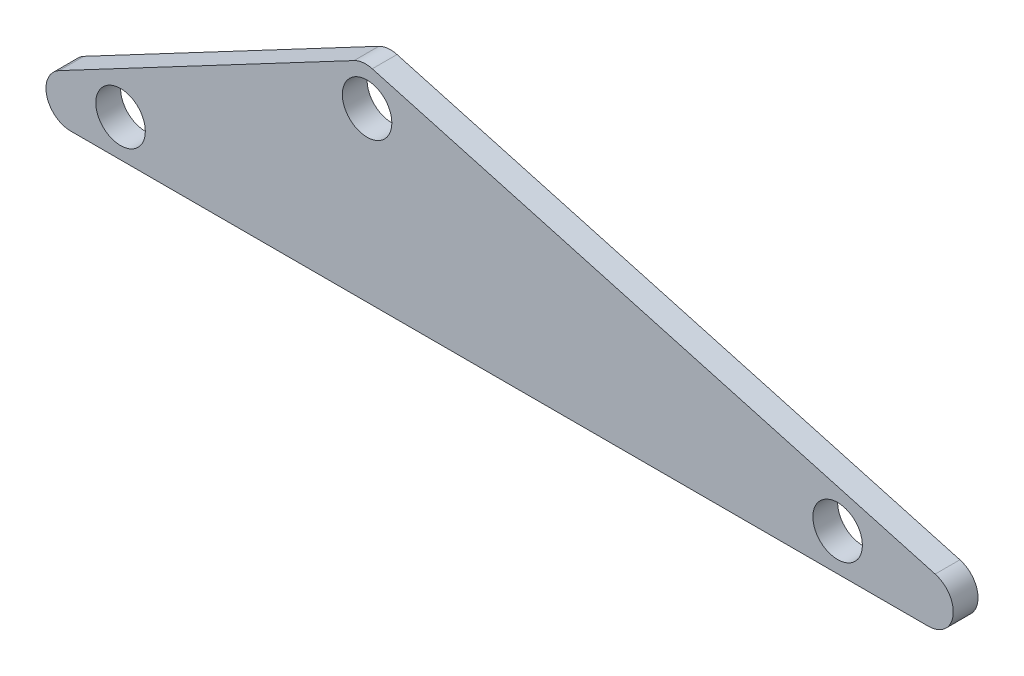
ISO-10303-21;
HEADER;
FILE_DESCRIPTION(('STEP AP214'),'2;1');
FILE_NAME('part.step','',(''),(''),'','','');
FILE_SCHEMA(('AUTOMOTIVE_DESIGN { 1 0 10303 214 1 1 1 1 }'));
ENDSEC;
DATA;
#1=APPLICATION_CONTEXT('core data for automotive mechanical design processes');
#2=APPLICATION_PROTOCOL_DEFINITION('international standard','automotive_design',2000,#1);
#3=PRODUCT_CONTEXT('',#1,'mechanical');
#4=PRODUCT('Part','Part','',(#3));
#5=PRODUCT_RELATED_PRODUCT_CATEGORY('part','',(#4));
#6=PRODUCT_DEFINITION_FORMATION('','',#4);
#7=PRODUCT_DEFINITION_CONTEXT('part definition',#1,'design');
#8=PRODUCT_DEFINITION('design','',#6,#7);
#9=PRODUCT_DEFINITION_SHAPE('','',#8);
#10=(LENGTH_UNIT() NAMED_UNIT(*) SI_UNIT(.MILLI.,.METRE.));
#11=(NAMED_UNIT(*) PLANE_ANGLE_UNIT() SI_UNIT($,.RADIAN.));
#12=(NAMED_UNIT(*) SI_UNIT($,.STERADIAN.) SOLID_ANGLE_UNIT());
#13=UNCERTAINTY_MEASURE_WITH_UNIT(LENGTH_MEASURE(1.E-05),#10,'distance_accuracy_value','');
#14=(GEOMETRIC_REPRESENTATION_CONTEXT(3) GLOBAL_UNCERTAINTY_ASSIGNED_CONTEXT((#13)) GLOBAL_UNIT_ASSIGNED_CONTEXT((#10,
#11,#12)) REPRESENTATION_CONTEXT('',''));
#15=CARTESIAN_POINT('',(0.,0.,0.));
#16=DIRECTION('',(0.,0.,1.));
#17=DIRECTION('',(1.,0.,0.));
#18=AXIS2_PLACEMENT_3D('',#15,#16,#17);
#19=CARTESIAN_POINT('',(6.55322372625613,4.58536762338372,0.5));
#20=DIRECTION('',(0.,0.,-1.));
#21=DIRECTION('',(-1.,0.,0.));
#22=AXIS2_PLACEMENT_3D('',#19,#20,#21);
#23=PLANE('',#22);
#24=CARTESIAN_POINT('',(6.55322372625613,4.58536762338372,0.5));
#25=DIRECTION('',(0.,0.,-1.));
#26=DIRECTION('',(-1.,0.,0.));
#27=AXIS2_PLACEMENT_3D('',#24,#25,#26);
#28=CIRCLE('',#27,1.);
#29=CARTESIAN_POINT('',(6.08530950865485,5.46914151130221,0.5));
#30=VERTEX_POINT('',#29);
#31=CARTESIAN_POINT('',(6.82051050311727,5.54898465255827,0.5));
#32=VERTEX_POINT('',#31);
#33=EDGE_CURVE('E195',#30,#32,#28,.T.);
#34=ORIENTED_EDGE('',*,*,#33,.F.);
#35=DIRECTION('',(-0.8837738879185,-0.46791421760128,0.));
#36=VECTOR('',#35,1.);
#37=CARTESIAN_POINT('',(6.08530950865485,5.46914151130221,0.5));
#38=LINE('',#37,#36);
#39=CARTESIAN_POINT('',(-5.83043779810387,-0.839652688658046,0.5));
#40=VERTEX_POINT('',#39);
#41=EDGE_CURVE('E162',#30,#40,#38,.T.);
#42=ORIENTED_EDGE('',*,*,#41,.T.);
#43=CARTESIAN_POINT('',(-5.36252358050265,-1.72342657657658,0.5));
#44=DIRECTION('',(0.,0.,1.));
#45=DIRECTION('',(1.,0.,0.));
#46=AXIS2_PLACEMENT_3D('',#43,#44,#45);
#47=CIRCLE('',#46,1.);
#48=CARTESIAN_POINT('',(-5.36252358050259,-2.72342657657658,0.5));
#49=VERTEX_POINT('',#48);
#50=EDGE_CURVE('E156',#40,#49,#47,.T.);
#51=ORIENTED_EDGE('',*,*,#50,.T.);
#52=DIRECTION('',(1.,0.,0.));
#53=VECTOR('',#52,1.);
#54=CARTESIAN_POINT('',(-5.36252358050259,-2.72342657657658,0.5));
#55=LINE('',#54,#53);
#56=CARTESIAN_POINT('',(29.2975644528373,-2.72342657657658,0.5));
#57=VERTEX_POINT('',#56);
#58=EDGE_CURVE('E160',#49,#57,#55,.T.);
#59=ORIENTED_EDGE('',*,*,#58,.T.);
#60=CARTESIAN_POINT('',(29.2975644528375,-1.72342657657658,0.5));
#61=DIRECTION('',(0.,0.,1.));
#62=DIRECTION('',(1.,0.,0.));
#63=AXIS2_PLACEMENT_3D('',#60,#61,#62);
#64=CIRCLE('',#63,0.999999999999999);
#65=CARTESIAN_POINT('',(29.5648512296985,-0.759809547401975,0.5));
#66=VERTEX_POINT('',#65);
#67=EDGE_CURVE('E177',#57,#66,#64,.T.);
#68=ORIENTED_EDGE('',*,*,#67,.T.);
#69=DIRECTION('',(-0.96361702917455,0.267286776861134,0.));
#70=VECTOR('',#69,1.);
#71=CARTESIAN_POINT('',(29.5648512296985,-0.759809547401975,0.5));
#72=LINE('',#71,#70);
#73=EDGE_CURVE('E148',#66,#32,#72,.T.);
#74=ORIENTED_EDGE('',*,*,#73,.T.);
#75=EDGE_LOOP('',(#34,#42,#51,#59,#68,#74));
#76=FACE_BOUND('',#75,.T.);
#77=CARTESIAN_POINT('',(6.61132432432433,4.05037342342342,0.5));
#78=DIRECTION('',(0.,0.,1.));
#79=DIRECTION('',(1.,0.,0.));
#80=AXIS2_PLACEMENT_3D('',#77,#78,#79);
#81=CIRCLE('',#80,1.);
#82=CARTESIAN_POINT('',(7.61132432432433,4.05037342342342,0.5));
#83=VERTEX_POINT('',#82);
#84=EDGE_CURVE('E187',#83,#83,#81,.T.);
#85=ORIENTED_EDGE('',*,*,#84,.F.);
#86=EDGE_LOOP('',(#85));
#87=FACE_BOUND('',#86,.T.);
#88=CARTESIAN_POINT('',(25.6243243243243,-1.22342657657658,0.5));
#89=DIRECTION('',(0.,0.,1.));
#90=DIRECTION('',(1.,0.,0.));
#91=AXIS2_PLACEMENT_3D('',#88,#89,#90);
#92=CIRCLE('',#91,1.);
#93=CARTESIAN_POINT('',(26.6243243243243,-1.22342657657658,0.5));
#94=VERTEX_POINT('',#93);
#95=EDGE_CURVE('E215',#94,#94,#92,.T.);
#96=ORIENTED_EDGE('',*,*,#95,.F.);
#97=EDGE_LOOP('',(#96));
#98=FACE_BOUND('',#97,.T.);
#99=CARTESIAN_POINT('',(-3.34957567567567,-1.22342657657658,0.5));
#100=DIRECTION('',(0.,0.,1.));
#101=DIRECTION('',(1.,0.,0.));
#102=AXIS2_PLACEMENT_3D('',#99,#100,#101);
#103=CIRCLE('',#102,1.);
#104=CARTESIAN_POINT('',(-2.34957567567567,-1.22342657657658,0.5));
#105=VERTEX_POINT('',#104);
#106=EDGE_CURVE('E221',#105,#105,#103,.T.);
#107=ORIENTED_EDGE('',*,*,#106,.F.);
#108=EDGE_LOOP('',(#107));
#109=FACE_BOUND('',#108,.T.);
#110=ADVANCED_FACE('F98',(#76,#87,#98,#109),#23,.F.);
#111=CARTESIAN_POINT('',(6.55322372625613,4.58536762338372,-0.5));
#112=DIRECTION('',(0.,0.,-1.));
#113=DIRECTION('',(-1.,0.,0.));
#114=AXIS2_PLACEMENT_3D('',#111,#112,#113);
#115=PLANE('',#114);
#116=CARTESIAN_POINT('',(25.6243243243243,-1.22342657657658,-0.5));
#117=DIRECTION('',(0.,0.,1.));
#118=DIRECTION('',(1.,0.,0.));
#119=AXIS2_PLACEMENT_3D('',#116,#117,#118);
#120=CIRCLE('',#119,1.);
#121=CARTESIAN_POINT('',(26.6243243243243,-1.22342657657658,-0.5));
#122=VERTEX_POINT('',#121);
#123=EDGE_CURVE('E218',#122,#122,#120,.T.);
#124=ORIENTED_EDGE('',*,*,#123,.T.);
#125=EDGE_LOOP('',(#124));
#126=FACE_BOUND('',#125,.T.);
#127=CARTESIAN_POINT('',(6.55322372625613,4.58536762338372,-0.5));
#128=DIRECTION('',(0.,0.,-1.));
#129=DIRECTION('',(-1.,0.,0.));
#130=AXIS2_PLACEMENT_3D('',#127,#128,#129);
#131=CIRCLE('',#130,1.);
#132=CARTESIAN_POINT('',(6.08530950865485,5.46914151130221,-0.5));
#133=VERTEX_POINT('',#132);
#134=CARTESIAN_POINT('',(6.82051050311727,5.54898465255827,-0.5));
#135=VERTEX_POINT('',#134);
#136=EDGE_CURVE('E183',#133,#135,#131,.T.);
#137=ORIENTED_EDGE('',*,*,#136,.T.);
#138=DIRECTION('',(-0.96361702917455,0.267286776861134,0.));
#139=VECTOR('',#138,1.);
#140=CARTESIAN_POINT('',(29.5648512296985,-0.759809547401975,-0.5));
#141=LINE('',#140,#139);
#142=CARTESIAN_POINT('',(29.5648512296985,-0.759809547401975,-0.5));
#143=VERTEX_POINT('',#142);
#144=EDGE_CURVE('E186',#143,#135,#141,.T.);
#145=ORIENTED_EDGE('',*,*,#144,.F.);
#146=CARTESIAN_POINT('',(29.2975644528375,-1.72342657657658,-0.5));
#147=DIRECTION('',(0.,0.,1.));
#148=DIRECTION('',(1.,0.,0.));
#149=AXIS2_PLACEMENT_3D('',#146,#147,#148);
#150=CIRCLE('',#149,0.999999999999999);
#151=CARTESIAN_POINT('',(29.2975644528373,-2.72342657657658,-0.5));
#152=VERTEX_POINT('',#151);
#153=EDGE_CURVE('E190',#152,#143,#150,.T.);
#154=ORIENTED_EDGE('',*,*,#153,.F.);
#155=DIRECTION('',(1.,0.,0.));
#156=VECTOR('',#155,1.);
#157=CARTESIAN_POINT('',(-5.36252358050259,-2.72342657657658,-0.5));
#158=LINE('',#157,#156);
#159=CARTESIAN_POINT('',(-5.36252358050259,-2.72342657657658,-0.5));
#160=VERTEX_POINT('',#159);
#161=EDGE_CURVE('E192',#160,#152,#158,.T.);
#162=ORIENTED_EDGE('',*,*,#161,.F.);
#163=CARTESIAN_POINT('',(-5.36252358050265,-1.72342657657658,-0.5));
#164=DIRECTION('',(0.,0.,1.));
#165=DIRECTION('',(1.,0.,0.));
#166=AXIS2_PLACEMENT_3D('',#163,#164,#165);
#167=CIRCLE('',#166,1.);
#168=CARTESIAN_POINT('',(-5.83043779810387,-0.839652688658046,-0.5));
#169=VERTEX_POINT('',#168);
#170=EDGE_CURVE('E169',#169,#160,#167,.T.);
#171=ORIENTED_EDGE('',*,*,#170,.F.);
#172=DIRECTION('',(-0.8837738879185,-0.46791421760128,0.));
#173=VECTOR('',#172,1.);
#174=CARTESIAN_POINT('',(6.08530950865485,5.46914151130221,-0.5));
#175=LINE('',#174,#173);
#176=EDGE_CURVE('E138',#133,#169,#175,.T.);
#177=ORIENTED_EDGE('',*,*,#176,.F.);
#178=EDGE_LOOP('',(#137,#145,#154,#162,#171,#177));
#179=FACE_BOUND('',#178,.T.);
#180=CARTESIAN_POINT('',(6.61132432432433,4.05037342342342,-0.5));
#181=DIRECTION('',(0.,0.,1.));
#182=DIRECTION('',(1.,0.,0.));
#183=AXIS2_PLACEMENT_3D('',#180,#181,#182);
#184=CIRCLE('',#183,1.);
#185=CARTESIAN_POINT('',(7.61132432432433,4.05037342342342,-0.5));
#186=VERTEX_POINT('',#185);
#187=EDGE_CURVE('E212',#186,#186,#184,.T.);
#188=ORIENTED_EDGE('',*,*,#187,.T.);
#189=EDGE_LOOP('',(#188));
#190=FACE_BOUND('',#189,.T.);
#191=CARTESIAN_POINT('',(-3.34957567567567,-1.22342657657658,-0.5));
#192=DIRECTION('',(0.,0.,1.));
#193=DIRECTION('',(1.,0.,0.));
#194=AXIS2_PLACEMENT_3D('',#191,#192,#193);
#195=CIRCLE('',#194,1.);
#196=CARTESIAN_POINT('',(-2.34957567567567,-1.22342657657658,-0.5));
#197=VERTEX_POINT('',#196);
#198=EDGE_CURVE('E224',#197,#197,#195,.T.);
#199=ORIENTED_EDGE('',*,*,#198,.T.);
#200=EDGE_LOOP('',(#199));
#201=FACE_BOUND('',#200,.T.);
#202=ADVANCED_FACE('F206',(#126,#179,#190,#201),#115,.T.);
#203=CARTESIAN_POINT('',(6.55322372625613,4.58536762338372,0.5));
#204=DIRECTION('',(0.,0.,-1.));
#205=DIRECTION('',(-1.,0.,0.));
#206=AXIS2_PLACEMENT_3D('',#203,#204,#205);
#207=CYLINDRICAL_SURFACE('',#206,1.);
#208=ORIENTED_EDGE('',*,*,#136,.F.);
#209=DIRECTION('',(0.,0.,-1.));
#210=VECTOR('',#209,1.);
#211=CARTESIAN_POINT('',(6.08530950865485,5.46914151130221,0.5));
#212=LINE('',#211,#210);
#213=EDGE_CURVE('E12',#30,#133,#212,.T.);
#214=ORIENTED_EDGE('',*,*,#213,.F.);
#215=ORIENTED_EDGE('',*,*,#33,.T.);
#216=DIRECTION('',(0.,0.,-1.));
#217=VECTOR('',#216,1.);
#218=CARTESIAN_POINT('',(6.82051050311727,5.54898465255827,0.5));
#219=LINE('',#218,#217);
#220=EDGE_CURVE('E102',#32,#135,#219,.T.);
#221=ORIENTED_EDGE('',*,*,#220,.T.);
#222=EDGE_LOOP('',(#208,#214,#215,#221));
#223=FACE_BOUND('',#222,.T.);
#224=ADVANCED_FACE('F100',(#223),#207,.T.);
#225=CARTESIAN_POINT('',(6.08530950865485,5.46914151130221,0.5));
#226=DIRECTION('',(0.46791421760128,-0.8837738879185,0.));
#227=DIRECTION('',(0.8837738879185,0.46791421760128,0.));
#228=AXIS2_PLACEMENT_3D('',#225,#226,#227);
#229=PLANE('',#228);
#230=ORIENTED_EDGE('',*,*,#176,.T.);
#231=DIRECTION('',(0.,0.,-1.));
#232=VECTOR('',#231,1.);
#233=CARTESIAN_POINT('',(-5.83043779810387,-0.839652688658046,0.5));
#234=LINE('',#233,#232);
#235=EDGE_CURVE('E108',#40,#169,#234,.T.);
#236=ORIENTED_EDGE('',*,*,#235,.F.);
#237=ORIENTED_EDGE('',*,*,#41,.F.);
#238=ORIENTED_EDGE('',*,*,#213,.T.);
#239=EDGE_LOOP('',(#230,#236,#237,#238));
#240=FACE_BOUND('',#239,.T.);
#241=ADVANCED_FACE('F244',(#240),#229,.F.);
#242=CARTESIAN_POINT('',(-5.36252358050265,-1.72342657657658,0.5));
#243=DIRECTION('',(0.,0.,-1.));
#244=DIRECTION('',(-1.,0.,0.));
#245=AXIS2_PLACEMENT_3D('',#242,#243,#244);
#246=CYLINDRICAL_SURFACE('',#245,1.);
#247=ORIENTED_EDGE('',*,*,#170,.T.);
#248=DIRECTION('',(0.,0.,-1.));
#249=VECTOR('',#248,1.);
#250=CARTESIAN_POINT('',(-5.36252358050259,-2.72342657657658,0.5));
#251=LINE('',#250,#249);
#252=EDGE_CURVE('E166',#49,#160,#251,.T.);
#253=ORIENTED_EDGE('',*,*,#252,.F.);
#254=ORIENTED_EDGE('',*,*,#50,.F.);
#255=ORIENTED_EDGE('',*,*,#235,.T.);
#256=EDGE_LOOP('',(#247,#253,#254,#255));
#257=FACE_BOUND('',#256,.T.);
#258=ADVANCED_FACE('F167',(#257),#246,.T.);
#259=CARTESIAN_POINT('',(-5.36252358050259,-2.72342657657658,0.5));
#260=DIRECTION('',(0.,1.,0.));
#261=DIRECTION('',(0.,0.,1.));
#262=AXIS2_PLACEMENT_3D('',#259,#260,#261);
#263=PLANE('',#262);
#264=ORIENTED_EDGE('',*,*,#161,.T.);
#265=DIRECTION('',(0.,0.,-1.));
#266=VECTOR('',#265,1.);
#267=CARTESIAN_POINT('',(29.2975644528373,-2.72342657657658,0.5));
#268=LINE('',#267,#266);
#269=EDGE_CURVE('E172',#57,#152,#268,.T.);
#270=ORIENTED_EDGE('',*,*,#269,.F.);
#271=ORIENTED_EDGE('',*,*,#58,.F.);
#272=ORIENTED_EDGE('',*,*,#252,.T.);
#273=EDGE_LOOP('',(#264,#270,#271,#272));
#274=FACE_BOUND('',#273,.T.);
#275=ADVANCED_FACE('F174',(#274),#263,.F.);
#276=CARTESIAN_POINT('',(29.2975644528375,-1.72342657657658,0.5));
#277=DIRECTION('',(0.,0.,-1.));
#278=DIRECTION('',(-1.,0.,0.));
#279=AXIS2_PLACEMENT_3D('',#276,#277,#278);
#280=CYLINDRICAL_SURFACE('',#279,0.999999999999999);
#281=ORIENTED_EDGE('',*,*,#153,.T.);
#282=DIRECTION('',(0.,0.,-1.));
#283=VECTOR('',#282,1.);
#284=CARTESIAN_POINT('',(29.5648512296985,-0.759809547401975,0.5));
#285=LINE('',#284,#283);
#286=EDGE_CURVE('E198',#66,#143,#285,.T.);
#287=ORIENTED_EDGE('',*,*,#286,.F.);
#288=ORIENTED_EDGE('',*,*,#67,.F.);
#289=ORIENTED_EDGE('',*,*,#269,.T.);
#290=EDGE_LOOP('',(#281,#287,#288,#289));
#291=FACE_BOUND('',#290,.T.);
#292=ADVANCED_FACE('F209',(#291),#280,.T.);
#293=CARTESIAN_POINT('',(29.5648512296985,-0.759809547401975,0.5));
#294=DIRECTION('',(-0.267286776861134,-0.96361702917455,0.));
#295=DIRECTION('',(0.96361702917455,-0.267286776861134,0.));
#296=AXIS2_PLACEMENT_3D('',#293,#294,#295);
#297=PLANE('',#296);
#298=ORIENTED_EDGE('',*,*,#144,.T.);
#299=ORIENTED_EDGE('',*,*,#220,.F.);
#300=ORIENTED_EDGE('',*,*,#73,.F.);
#301=ORIENTED_EDGE('',*,*,#286,.T.);
#302=EDGE_LOOP('',(#298,#299,#300,#301));
#303=FACE_BOUND('',#302,.T.);
#304=ADVANCED_FACE('F203',(#303),#297,.F.);
#305=CARTESIAN_POINT('',(6.61132432432433,4.05037342342342,0.5));
#306=DIRECTION('',(0.,0.,-1.));
#307=DIRECTION('',(-1.,0.,0.));
#308=AXIS2_PLACEMENT_3D('',#305,#306,#307);
#309=CYLINDRICAL_SURFACE('',#308,1.);
#310=ORIENTED_EDGE('',*,*,#84,.T.);
#311=EDGE_LOOP('',(#310));
#312=FACE_BOUND('',#311,.T.);
#313=ORIENTED_EDGE('',*,*,#187,.F.);
#314=EDGE_LOOP('',(#313));
#315=FACE_BOUND('',#314,.T.);
#316=ADVANCED_FACE('F241',(#312,#315),#309,.F.);
#317=CARTESIAN_POINT('',(25.6243243243243,-1.22342657657658,0.5));
#318=DIRECTION('',(0.,0.,-1.));
#319=DIRECTION('',(-1.,0.,0.));
#320=AXIS2_PLACEMENT_3D('',#317,#318,#319);
#321=CYLINDRICAL_SURFACE('',#320,1.);
#322=ORIENTED_EDGE('',*,*,#95,.T.);
#323=EDGE_LOOP('',(#322));
#324=FACE_BOUND('',#323,.T.);
#325=ORIENTED_EDGE('',*,*,#123,.F.);
#326=EDGE_LOOP('',(#325));
#327=FACE_BOUND('',#326,.T.);
#328=ADVANCED_FACE('F256',(#324,#327),#321,.F.);
#329=CARTESIAN_POINT('',(-3.34957567567567,-1.22342657657658,0.5));
#330=DIRECTION('',(0.,0.,-1.));
#331=DIRECTION('',(-1.,0.,0.));
#332=AXIS2_PLACEMENT_3D('',#329,#330,#331);
#333=CYLINDRICAL_SURFACE('',#332,1.);
#334=ORIENTED_EDGE('',*,*,#106,.T.);
#335=EDGE_LOOP('',(#334));
#336=FACE_BOUND('',#335,.T.);
#337=ORIENTED_EDGE('',*,*,#198,.F.);
#338=EDGE_LOOP('',(#337));
#339=FACE_BOUND('',#338,.T.);
#340=ADVANCED_FACE('F230',(#336,#339),#333,.F.);
#341=CLOSED_SHELL('',(#110,#202,#224,#241,#258,#275,#292,#304,#316,#328,#340));
#342=MANIFOLD_SOLID_BREP('B2',#341);
#343=ADVANCED_BREP_SHAPE_REPRESENTATION('',(#18,#342),#14);
#344=SHAPE_DEFINITION_REPRESENTATION(#9,#343);
ENDSEC;
END-ISO-10303-21;
